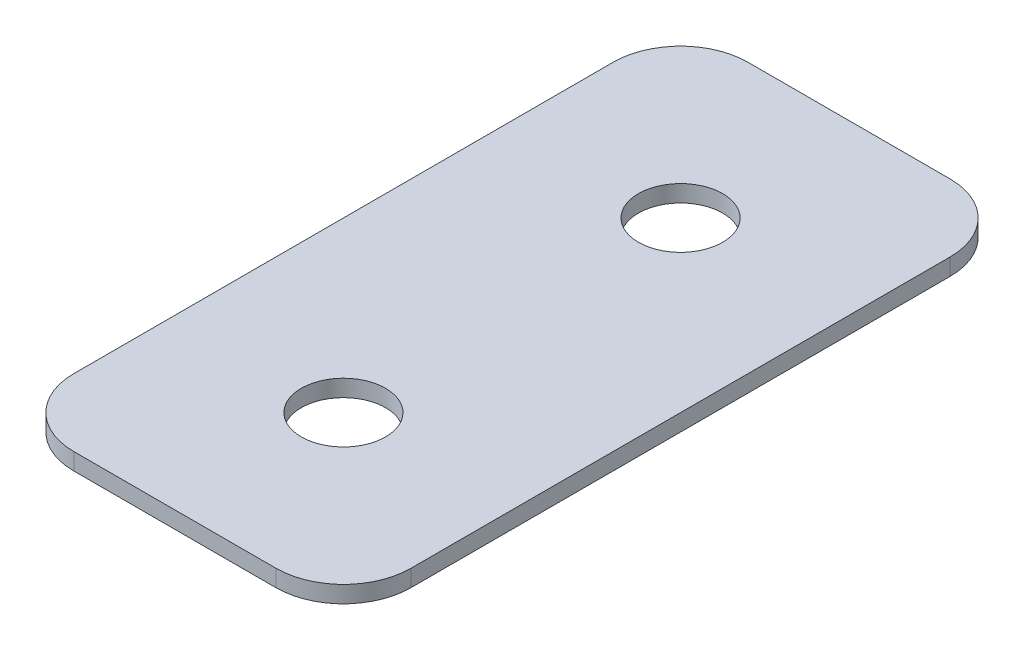
ISO-10303-21;
HEADER;
FILE_DESCRIPTION(('STEP AP214'),'2;1');
FILE_NAME('part.step','',(''),(''),'','','');
FILE_SCHEMA(('AUTOMOTIVE_DESIGN { 1 0 10303 214 1 1 1 1 }'));
ENDSEC;
DATA;
#1=APPLICATION_CONTEXT('core data for automotive mechanical design processes');
#2=APPLICATION_PROTOCOL_DEFINITION('international standard','automotive_design',2000,#1);
#3=PRODUCT_CONTEXT('',#1,'mechanical');
#4=PRODUCT('Part','Part','',(#3));
#5=PRODUCT_RELATED_PRODUCT_CATEGORY('part','',(#4));
#6=PRODUCT_DEFINITION_FORMATION('','',#4);
#7=PRODUCT_DEFINITION_CONTEXT('part definition',#1,'design');
#8=PRODUCT_DEFINITION('design','',#6,#7);
#9=PRODUCT_DEFINITION_SHAPE('','',#8);
#10=(LENGTH_UNIT() NAMED_UNIT(*) SI_UNIT(.MILLI.,.METRE.));
#11=(NAMED_UNIT(*) PLANE_ANGLE_UNIT() SI_UNIT($,.RADIAN.));
#12=(NAMED_UNIT(*) SI_UNIT($,.STERADIAN.) SOLID_ANGLE_UNIT());
#13=UNCERTAINTY_MEASURE_WITH_UNIT(LENGTH_MEASURE(1.E-05),#10,'distance_accuracy_value','');
#14=(GEOMETRIC_REPRESENTATION_CONTEXT(3) GLOBAL_UNCERTAINTY_ASSIGNED_CONTEXT((#13)) GLOBAL_UNIT_ASSIGNED_CONTEXT((#10,
#11,#12)) REPRESENTATION_CONTEXT('',''));
#15=CARTESIAN_POINT('',(0.,0.,0.));
#16=DIRECTION('',(0.,0.,1.));
#17=DIRECTION('',(1.,0.,0.));
#18=AXIS2_PLACEMENT_3D('',#15,#16,#17);
#19=CARTESIAN_POINT('',(-4.,1.,-4.));
#20=DIRECTION('',(0.,-1.,0.));
#21=DIRECTION('',(0.,0.,-1.));
#22=AXIS2_PLACEMENT_3D('',#19,#20,#21);
#23=PLANE('',#22);
#24=CARTESIAN_POINT('',(-4.,1.,-4.));
#25=DIRECTION('',(0.,1.,0.));
#26=DIRECTION('',(0.,0.,-1.));
#27=AXIS2_PLACEMENT_3D('',#24,#25,#26);
#28=CIRCLE('',#27,4.);
#29=CARTESIAN_POINT('',(-4.00000000000003,1.,0.));
#30=VERTEX_POINT('',#29);
#31=CARTESIAN_POINT('',(0.,1.,-4.00000000000003));
#32=VERTEX_POINT('',#31);
#33=EDGE_CURVE('E147',#30,#32,#28,.T.);
#34=ORIENTED_EDGE('',*,*,#33,.T.);
#35=DIRECTION('',(0.,0.,-1.));
#36=VECTOR('',#35,1.);
#37=CARTESIAN_POINT('',(0.,1.,-36.));
#38=LINE('',#37,#36);
#39=CARTESIAN_POINT('',(0.,1.,-36.));
#40=VERTEX_POINT('',#39);
#41=EDGE_CURVE('E95',#32,#40,#38,.T.);
#42=ORIENTED_EDGE('',*,*,#41,.T.);
#43=CARTESIAN_POINT('',(-4.,1.,-36.));
#44=DIRECTION('',(0.,1.,0.));
#45=DIRECTION('',(0.,0.,1.));
#46=AXIS2_PLACEMENT_3D('',#43,#44,#45);
#47=CIRCLE('',#46,4.);
#48=CARTESIAN_POINT('',(-4.00000000000003,1.,-40.));
#49=VERTEX_POINT('',#48);
#50=EDGE_CURVE('E162',#40,#49,#47,.T.);
#51=ORIENTED_EDGE('',*,*,#50,.T.);
#52=DIRECTION('',(-1.,0.,0.));
#53=VECTOR('',#52,1.);
#54=CARTESIAN_POINT('',(-16.,1.,-40.));
#55=LINE('',#54,#53);
#56=CARTESIAN_POINT('',(-16.,1.,-40.));
#57=VERTEX_POINT('',#56);
#58=EDGE_CURVE('E175',#49,#57,#55,.T.);
#59=ORIENTED_EDGE('',*,*,#58,.T.);
#60=CARTESIAN_POINT('',(-16.,1.,-36.));
#61=DIRECTION('',(0.,1.,0.));
#62=DIRECTION('',(0.,0.,1.));
#63=AXIS2_PLACEMENT_3D('',#60,#61,#62);
#64=CIRCLE('',#63,4.);
#65=CARTESIAN_POINT('',(-20.,1.,-36.));
#66=VERTEX_POINT('',#65);
#67=EDGE_CURVE('E114',#57,#66,#64,.T.);
#68=ORIENTED_EDGE('',*,*,#67,.T.);
#69=DIRECTION('',(0.,0.,1.));
#70=VECTOR('',#69,1.);
#71=CARTESIAN_POINT('',(-20.,1.,-4.00000000000003));
#72=LINE('',#71,#70);
#73=CARTESIAN_POINT('',(-20.,1.,-4.00000000000003));
#74=VERTEX_POINT('',#73);
#75=EDGE_CURVE('E108',#66,#74,#72,.T.);
#76=ORIENTED_EDGE('',*,*,#75,.T.);
#77=CARTESIAN_POINT('',(-16.,1.,-4.));
#78=DIRECTION('',(0.,1.,0.));
#79=DIRECTION('',(0.,0.,1.));
#80=AXIS2_PLACEMENT_3D('',#77,#78,#79);
#81=CIRCLE('',#80,4.);
#82=CARTESIAN_POINT('',(-16.,1.,0.));
#83=VERTEX_POINT('',#82);
#84=EDGE_CURVE('E112',#74,#83,#81,.T.);
#85=ORIENTED_EDGE('',*,*,#84,.T.);
#86=DIRECTION('',(1.,0.,0.));
#87=VECTOR('',#86,1.);
#88=CARTESIAN_POINT('',(-4.00000000000003,1.,0.));
#89=LINE('',#88,#87);
#90=EDGE_CURVE('E52',#83,#30,#89,.T.);
#91=ORIENTED_EDGE('',*,*,#90,.T.);
#92=EDGE_LOOP('',(#34,#42,#51,#59,#68,#76,#85,#91));
#93=FACE_BOUND('',#92,.T.);
#94=CARTESIAN_POINT('',(-10.,1.,-10.));
#95=DIRECTION('',(0.,1.,0.));
#96=DIRECTION('',(0.,0.,1.));
#97=AXIS2_PLACEMENT_3D('',#94,#95,#96);
#98=CIRCLE('',#97,2.5);
#99=CARTESIAN_POINT('',(-10.,1.,-7.5));
#100=VERTEX_POINT('',#99);
#101=EDGE_CURVE('E136',#100,#100,#98,.T.);
#102=ORIENTED_EDGE('',*,*,#101,.F.);
#103=EDGE_LOOP('',(#102));
#104=FACE_BOUND('',#103,.T.);
#105=CARTESIAN_POINT('',(-10.,1.,-30.));
#106=DIRECTION('',(0.,1.,0.));
#107=DIRECTION('',(0.,0.,1.));
#108=AXIS2_PLACEMENT_3D('',#105,#106,#107);
#109=CIRCLE('',#108,2.5);
#110=CARTESIAN_POINT('',(-10.,1.,-27.5));
#111=VERTEX_POINT('',#110);
#112=EDGE_CURVE('E184',#111,#111,#109,.T.);
#113=ORIENTED_EDGE('',*,*,#112,.F.);
#114=EDGE_LOOP('',(#113));
#115=FACE_BOUND('',#114,.T.);
#116=ADVANCED_FACE('F35',(#93,#104,#115),#23,.F.);
#117=CARTESIAN_POINT('',(-4.,0.,-4.));
#118=DIRECTION('',(0.,-1.,0.));
#119=DIRECTION('',(0.,0.,-1.));
#120=AXIS2_PLACEMENT_3D('',#117,#118,#119);
#121=PLANE('',#120);
#122=CARTESIAN_POINT('',(-10.,0.,-10.));
#123=DIRECTION('',(0.,1.,0.));
#124=DIRECTION('',(0.,0.,1.));
#125=AXIS2_PLACEMENT_3D('',#122,#123,#124);
#126=CIRCLE('',#125,2.5);
#127=CARTESIAN_POINT('',(-10.,0.,-7.5));
#128=VERTEX_POINT('',#127);
#129=EDGE_CURVE('E181',#128,#128,#126,.T.);
#130=ORIENTED_EDGE('',*,*,#129,.T.);
#131=EDGE_LOOP('',(#130));
#132=FACE_BOUND('',#131,.T.);
#133=CARTESIAN_POINT('',(-4.,0.,-4.));
#134=DIRECTION('',(0.,1.,0.));
#135=DIRECTION('',(0.,0.,-1.));
#136=AXIS2_PLACEMENT_3D('',#133,#134,#135);
#137=CIRCLE('',#136,4.);
#138=CARTESIAN_POINT('',(-4.00000000000003,0.,0.));
#139=VERTEX_POINT('',#138);
#140=CARTESIAN_POINT('',(0.,0.,-4.00000000000003));
#141=VERTEX_POINT('',#140);
#142=EDGE_CURVE('E132',#139,#141,#137,.T.);
#143=ORIENTED_EDGE('',*,*,#142,.F.);
#144=DIRECTION('',(1.,0.,0.));
#145=VECTOR('',#144,1.);
#146=CARTESIAN_POINT('',(-4.00000000000003,0.,0.));
#147=LINE('',#146,#145);
#148=CARTESIAN_POINT('',(-16.,0.,0.));
#149=VERTEX_POINT('',#148);
#150=EDGE_CURVE('E87',#149,#139,#147,.T.);
#151=ORIENTED_EDGE('',*,*,#150,.F.);
#152=CARTESIAN_POINT('',(-16.,0.,-4.));
#153=DIRECTION('',(0.,1.,0.));
#154=DIRECTION('',(0.,0.,1.));
#155=AXIS2_PLACEMENT_3D('',#152,#153,#154);
#156=CIRCLE('',#155,4.);
#157=CARTESIAN_POINT('',(-20.,0.,-4.00000000000003));
#158=VERTEX_POINT('',#157);
#159=EDGE_CURVE('E81',#158,#149,#156,.T.);
#160=ORIENTED_EDGE('',*,*,#159,.F.);
#161=DIRECTION('',(0.,0.,1.));
#162=VECTOR('',#161,1.);
#163=CARTESIAN_POINT('',(-20.,0.,-4.00000000000003));
#164=LINE('',#163,#162);
#165=CARTESIAN_POINT('',(-20.,0.,-36.));
#166=VERTEX_POINT('',#165);
#167=EDGE_CURVE('E122',#166,#158,#164,.T.);
#168=ORIENTED_EDGE('',*,*,#167,.F.);
#169=CARTESIAN_POINT('',(-16.,0.,-36.));
#170=DIRECTION('',(0.,1.,0.));
#171=DIRECTION('',(0.,0.,1.));
#172=AXIS2_PLACEMENT_3D('',#169,#170,#171);
#173=CIRCLE('',#172,4.);
#174=CARTESIAN_POINT('',(-16.,0.,-40.));
#175=VERTEX_POINT('',#174);
#176=EDGE_CURVE('E142',#175,#166,#173,.T.);
#177=ORIENTED_EDGE('',*,*,#176,.F.);
#178=DIRECTION('',(-1.,0.,0.));
#179=VECTOR('',#178,1.);
#180=CARTESIAN_POINT('',(-16.,0.,-40.));
#181=LINE('',#180,#179);
#182=CARTESIAN_POINT('',(-4.00000000000003,0.,-40.));
#183=VERTEX_POINT('',#182);
#184=EDGE_CURVE('E140',#183,#175,#181,.T.);
#185=ORIENTED_EDGE('',*,*,#184,.F.);
#186=CARTESIAN_POINT('',(-4.,0.,-36.));
#187=DIRECTION('',(0.,1.,0.));
#188=DIRECTION('',(0.,0.,1.));
#189=AXIS2_PLACEMENT_3D('',#186,#187,#188);
#190=CIRCLE('',#189,4.);
#191=CARTESIAN_POINT('',(0.,0.,-36.));
#192=VERTEX_POINT('',#191);
#193=EDGE_CURVE('E138',#192,#183,#190,.T.);
#194=ORIENTED_EDGE('',*,*,#193,.F.);
#195=DIRECTION('',(0.,0.,-1.));
#196=VECTOR('',#195,1.);
#197=CARTESIAN_POINT('',(0.,0.,-36.));
#198=LINE('',#197,#196);
#199=EDGE_CURVE('E135',#141,#192,#198,.T.);
#200=ORIENTED_EDGE('',*,*,#199,.F.);
#201=EDGE_LOOP('',(#143,#151,#160,#168,#177,#185,#194,#200));
#202=FACE_BOUND('',#201,.T.);
#203=CARTESIAN_POINT('',(-10.,0.,-30.));
#204=DIRECTION('',(0.,1.,0.));
#205=DIRECTION('',(0.,0.,1.));
#206=AXIS2_PLACEMENT_3D('',#203,#204,#205);
#207=CIRCLE('',#206,2.5);
#208=CARTESIAN_POINT('',(-10.,0.,-27.5));
#209=VERTEX_POINT('',#208);
#210=EDGE_CURVE('E187',#209,#209,#207,.T.);
#211=ORIENTED_EDGE('',*,*,#210,.T.);
#212=EDGE_LOOP('',(#211));
#213=FACE_BOUND('',#212,.T.);
#214=ADVANCED_FACE('F166',(#132,#202,#213),#121,.T.);
#215=CARTESIAN_POINT('',(-4.,1.,-4.));
#216=DIRECTION('',(0.,-1.,0.));
#217=DIRECTION('',(0.,0.,-1.));
#218=AXIS2_PLACEMENT_3D('',#215,#216,#217);
#219=CYLINDRICAL_SURFACE('',#218,4.);
#220=ORIENTED_EDGE('',*,*,#142,.T.);
#221=DIRECTION('',(0.,-1.,0.));
#222=VECTOR('',#221,1.);
#223=CARTESIAN_POINT('',(0.,1.,-4.00000000000003));
#224=LINE('',#223,#222);
#225=EDGE_CURVE('E11',#32,#141,#224,.T.);
#226=ORIENTED_EDGE('',*,*,#225,.F.);
#227=ORIENTED_EDGE('',*,*,#33,.F.);
#228=DIRECTION('',(0.,-1.,0.));
#229=VECTOR('',#228,1.);
#230=CARTESIAN_POINT('',(-4.00000000000003,1.,0.));
#231=LINE('',#230,#229);
#232=EDGE_CURVE('E128',#30,#139,#231,.T.);
#233=ORIENTED_EDGE('',*,*,#232,.T.);
#234=EDGE_LOOP('',(#220,#226,#227,#233));
#235=FACE_BOUND('',#234,.T.);
#236=ADVANCED_FACE('F37',(#235),#219,.T.);
#237=CARTESIAN_POINT('',(0.,1.,-36.));
#238=DIRECTION('',(-1.,0.,0.));
#239=DIRECTION('',(0.,0.,1.));
#240=AXIS2_PLACEMENT_3D('',#237,#238,#239);
#241=PLANE('',#240);
#242=ORIENTED_EDGE('',*,*,#199,.T.);
#243=DIRECTION('',(0.,-1.,0.));
#244=VECTOR('',#243,1.);
#245=CARTESIAN_POINT('',(0.,1.,-36.));
#246=LINE('',#245,#244);
#247=EDGE_CURVE('E44',#40,#192,#246,.T.);
#248=ORIENTED_EDGE('',*,*,#247,.F.);
#249=ORIENTED_EDGE('',*,*,#41,.F.);
#250=ORIENTED_EDGE('',*,*,#225,.T.);
#251=EDGE_LOOP('',(#242,#248,#249,#250));
#252=FACE_BOUND('',#251,.T.);
#253=ADVANCED_FACE('F219',(#252),#241,.F.);
#254=CARTESIAN_POINT('',(-4.,1.,-36.));
#255=DIRECTION('',(0.,-1.,0.));
#256=DIRECTION('',(0.,0.,-1.));
#257=AXIS2_PLACEMENT_3D('',#254,#255,#256);
#258=CYLINDRICAL_SURFACE('',#257,4.);
#259=ORIENTED_EDGE('',*,*,#193,.T.);
#260=DIRECTION('',(0.,-1.,0.));
#261=VECTOR('',#260,1.);
#262=CARTESIAN_POINT('',(-4.00000000000003,1.,-40.));
#263=LINE('',#262,#261);
#264=EDGE_CURVE('E154',#49,#183,#263,.T.);
#265=ORIENTED_EDGE('',*,*,#264,.F.);
#266=ORIENTED_EDGE('',*,*,#50,.F.);
#267=ORIENTED_EDGE('',*,*,#247,.T.);
#268=EDGE_LOOP('',(#259,#265,#266,#267));
#269=FACE_BOUND('',#268,.T.);
#270=ADVANCED_FACE('F160',(#269),#258,.T.);
#271=CARTESIAN_POINT('',(-16.,1.,-40.));
#272=DIRECTION('',(0.,0.,1.));
#273=DIRECTION('',(1.,0.,0.));
#274=AXIS2_PLACEMENT_3D('',#271,#272,#273);
#275=PLANE('',#274);
#276=ORIENTED_EDGE('',*,*,#184,.T.);
#277=DIRECTION('',(0.,-1.,0.));
#278=VECTOR('',#277,1.);
#279=CARTESIAN_POINT('',(-16.,1.,-40.));
#280=LINE('',#279,#278);
#281=EDGE_CURVE('E151',#57,#175,#280,.T.);
#282=ORIENTED_EDGE('',*,*,#281,.F.);
#283=ORIENTED_EDGE('',*,*,#58,.F.);
#284=ORIENTED_EDGE('',*,*,#264,.T.);
#285=EDGE_LOOP('',(#276,#282,#283,#284));
#286=FACE_BOUND('',#285,.T.);
#287=ADVANCED_FACE('F171',(#286),#275,.F.);
#288=CARTESIAN_POINT('',(-16.,1.,-36.));
#289=DIRECTION('',(0.,-1.,0.));
#290=DIRECTION('',(0.,0.,-1.));
#291=AXIS2_PLACEMENT_3D('',#288,#289,#290);
#292=CYLINDRICAL_SURFACE('',#291,4.);
#293=ORIENTED_EDGE('',*,*,#176,.T.);
#294=DIRECTION('',(0.,-1.,0.));
#295=VECTOR('',#294,1.);
#296=CARTESIAN_POINT('',(-20.,1.,-36.));
#297=LINE('',#296,#295);
#298=EDGE_CURVE('E123',#66,#166,#297,.T.);
#299=ORIENTED_EDGE('',*,*,#298,.F.);
#300=ORIENTED_EDGE('',*,*,#67,.F.);
#301=ORIENTED_EDGE('',*,*,#281,.T.);
#302=EDGE_LOOP('',(#293,#299,#300,#301));
#303=FACE_BOUND('',#302,.T.);
#304=ADVANCED_FACE('F174',(#303),#292,.T.);
#305=CARTESIAN_POINT('',(-20.,1.,-4.00000000000003));
#306=DIRECTION('',(1.,0.,0.));
#307=DIRECTION('',(0.,0.,-1.));
#308=AXIS2_PLACEMENT_3D('',#305,#306,#307);
#309=PLANE('',#308);
#310=ORIENTED_EDGE('',*,*,#167,.T.);
#311=DIRECTION('',(0.,-1.,0.));
#312=VECTOR('',#311,1.);
#313=CARTESIAN_POINT('',(-20.,1.,-4.00000000000003));
#314=LINE('',#313,#312);
#315=EDGE_CURVE('E119',#74,#158,#314,.T.);
#316=ORIENTED_EDGE('',*,*,#315,.F.);
#317=ORIENTED_EDGE('',*,*,#75,.F.);
#318=ORIENTED_EDGE('',*,*,#298,.T.);
#319=EDGE_LOOP('',(#310,#316,#317,#318));
#320=FACE_BOUND('',#319,.T.);
#321=ADVANCED_FACE('F120',(#320),#309,.F.);
#322=CARTESIAN_POINT('',(-16.,1.,-4.));
#323=DIRECTION('',(0.,-1.,0.));
#324=DIRECTION('',(0.,0.,-1.));
#325=AXIS2_PLACEMENT_3D('',#322,#323,#324);
#326=CYLINDRICAL_SURFACE('',#325,4.);
#327=ORIENTED_EDGE('',*,*,#159,.T.);
#328=DIRECTION('',(0.,-1.,0.));
#329=VECTOR('',#328,1.);
#330=CARTESIAN_POINT('',(-16.,1.,0.));
#331=LINE('',#330,#329);
#332=EDGE_CURVE('E124',#83,#149,#331,.T.);
#333=ORIENTED_EDGE('',*,*,#332,.F.);
#334=ORIENTED_EDGE('',*,*,#84,.F.);
#335=ORIENTED_EDGE('',*,*,#315,.T.);
#336=EDGE_LOOP('',(#327,#333,#334,#335));
#337=FACE_BOUND('',#336,.T.);
#338=ADVANCED_FACE('F126',(#337),#326,.T.);
#339=CARTESIAN_POINT('',(-4.00000000000003,1.,0.));
#340=DIRECTION('',(0.,0.,-1.));
#341=DIRECTION('',(-1.,0.,0.));
#342=AXIS2_PLACEMENT_3D('',#339,#340,#341);
#343=PLANE('',#342);
#344=ORIENTED_EDGE('',*,*,#150,.T.);
#345=ORIENTED_EDGE('',*,*,#232,.F.);
#346=ORIENTED_EDGE('',*,*,#90,.F.);
#347=ORIENTED_EDGE('',*,*,#332,.T.);
#348=EDGE_LOOP('',(#344,#345,#346,#347));
#349=FACE_BOUND('',#348,.T.);
#350=ADVANCED_FACE('F207',(#349),#343,.F.);
#351=CARTESIAN_POINT('',(-10.,1.,-10.));
#352=DIRECTION('',(0.,-1.,0.));
#353=DIRECTION('',(0.,0.,-1.));
#354=AXIS2_PLACEMENT_3D('',#351,#352,#353);
#355=CYLINDRICAL_SURFACE('',#354,2.5);
#356=ORIENTED_EDGE('',*,*,#101,.T.);
#357=EDGE_LOOP('',(#356));
#358=FACE_BOUND('',#357,.T.);
#359=ORIENTED_EDGE('',*,*,#129,.F.);
#360=EDGE_LOOP('',(#359));
#361=FACE_BOUND('',#360,.T.);
#362=ADVANCED_FACE('F204',(#358,#361),#355,.F.);
#363=CARTESIAN_POINT('',(-10.,1.,-30.));
#364=DIRECTION('',(0.,-1.,0.));
#365=DIRECTION('',(0.,0.,-1.));
#366=AXIS2_PLACEMENT_3D('',#363,#364,#365);
#367=CYLINDRICAL_SURFACE('',#366,2.5);
#368=ORIENTED_EDGE('',*,*,#112,.T.);
#369=EDGE_LOOP('',(#368));
#370=FACE_BOUND('',#369,.T.);
#371=ORIENTED_EDGE('',*,*,#210,.F.);
#372=EDGE_LOOP('',(#371));
#373=FACE_BOUND('',#372,.T.);
#374=ADVANCED_FACE('F193',(#370,#373),#367,.F.);
#375=CLOSED_SHELL('',(#116,#214,#236,#253,#270,#287,#304,#321,#338,#350,#362,#374));
#376=MANIFOLD_SOLID_BREP('B2',#375);
#377=ADVANCED_BREP_SHAPE_REPRESENTATION('',(#18,#376),#14);
#378=SHAPE_DEFINITION_REPRESENTATION(#9,#377);
ENDSEC;
END-ISO-10303-21;
